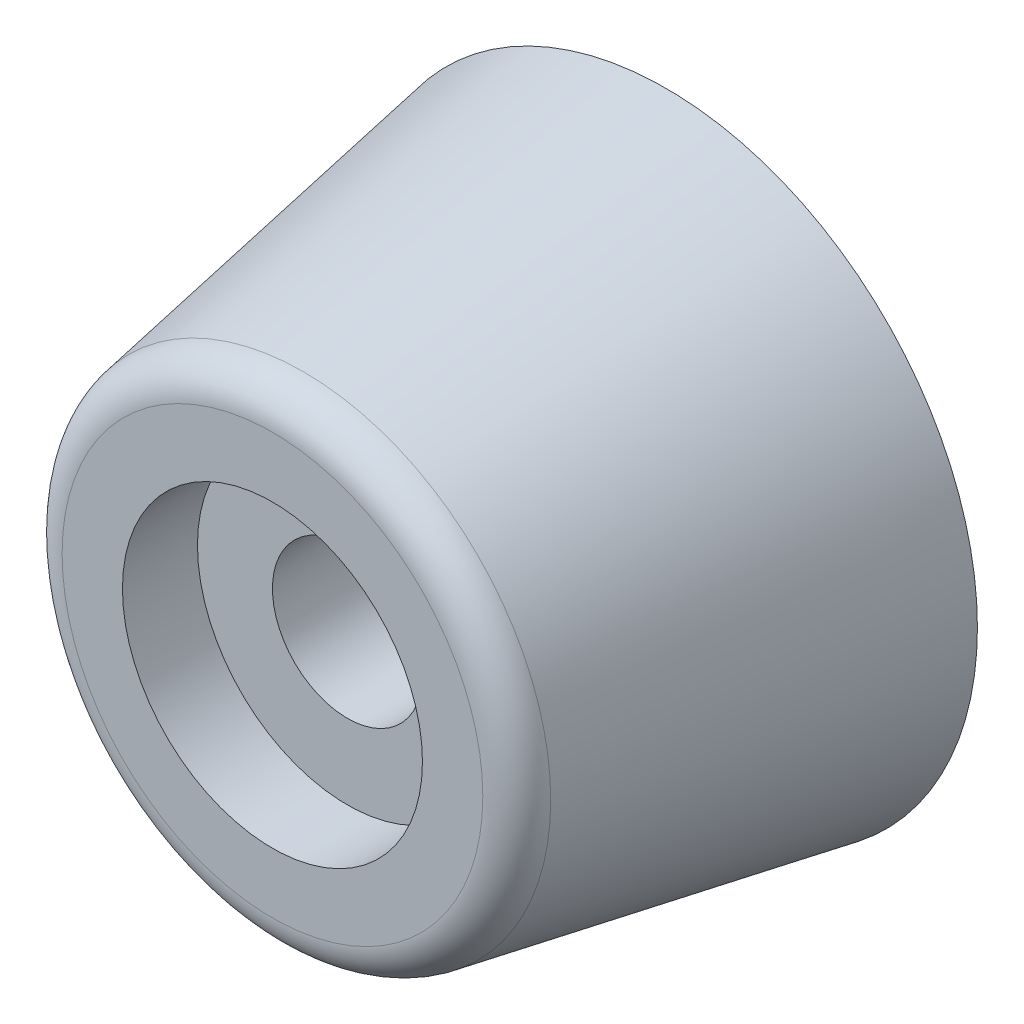
ISO-10303-21;
HEADER;
FILE_DESCRIPTION(('STEP AP214'),'2;1');
FILE_NAME('part.step','',(''),(''),'','','');
FILE_SCHEMA(('AUTOMOTIVE_DESIGN { 1 0 10303 214 1 1 1 1 }'));
ENDSEC;
DATA;
#1=APPLICATION_CONTEXT('core data for automotive mechanical design processes');
#2=APPLICATION_PROTOCOL_DEFINITION('international standard','automotive_design',2000,#1);
#3=PRODUCT_CONTEXT('',#1,'mechanical');
#4=PRODUCT('Part','Part','',(#3));
#5=PRODUCT_RELATED_PRODUCT_CATEGORY('part','',(#4));
#6=PRODUCT_DEFINITION_FORMATION('','',#4);
#7=PRODUCT_DEFINITION_CONTEXT('part definition',#1,'design');
#8=PRODUCT_DEFINITION('design','',#6,#7);
#9=PRODUCT_DEFINITION_SHAPE('','',#8);
#10=(LENGTH_UNIT() NAMED_UNIT(*) SI_UNIT(.MILLI.,.METRE.));
#11=(NAMED_UNIT(*) PLANE_ANGLE_UNIT() SI_UNIT($,.RADIAN.));
#12=(NAMED_UNIT(*) SI_UNIT($,.STERADIAN.) SOLID_ANGLE_UNIT());
#13=UNCERTAINTY_MEASURE_WITH_UNIT(LENGTH_MEASURE(1.E-05),#10,'distance_accuracy_value','');
#14=(GEOMETRIC_REPRESENTATION_CONTEXT(3) GLOBAL_UNCERTAINTY_ASSIGNED_CONTEXT((#13)) GLOBAL_UNIT_ASSIGNED_CONTEXT((#10,
#11,#12)) REPRESENTATION_CONTEXT('',''));
#15=CARTESIAN_POINT('',(0.,0.,0.));
#16=DIRECTION('',(0.,0.,1.));
#17=DIRECTION('',(1.,0.,0.));
#18=AXIS2_PLACEMENT_3D('',#15,#16,#17);
#19=CARTESIAN_POINT('',(0.,0.,0.));
#20=DIRECTION('',(0.,0.,-1.));
#21=DIRECTION('',(1.,0.,0.));
#22=AXIS2_PLACEMENT_3D('',#19,#20,#21);
#23=CONICAL_SURFACE('',#22,8.3,0.174532925199433);
#24=CARTESIAN_POINT('',(0.,0.,9.67364817766693));
#25=DIRECTION('',(0.,0.,-1.));
#26=DIRECTION('',(-1.,0.,0.));
#27=AXIS2_PLACEMENT_3D('',#24,#25,#26);
#28=CIRCLE('',#27,6.59427482439604);
#29=CARTESIAN_POINT('',(-6.59427482439604,0.,9.67364817766693));
#30=VERTEX_POINT('',#29);
#31=EDGE_CURVE('E10',#30,#30,#28,.T.);
#32=ORIENTED_EDGE('',*,*,#31,.T.);
#33=EDGE_LOOP('',(#32));
#34=FACE_BOUND('',#33,.T.);
#35=CARTESIAN_POINT('',(0.,0.,0.));
#36=DIRECTION('',(0.,0.,1.));
#37=DIRECTION('',(1.,0.,0.));
#38=AXIS2_PLACEMENT_3D('',#35,#36,#37);
#39=CIRCLE('',#38,8.3);
#40=CARTESIAN_POINT('',(8.3,0.,0.));
#41=VERTEX_POINT('',#40);
#42=EDGE_CURVE('E42',#41,#41,#39,.T.);
#43=ORIENTED_EDGE('',*,*,#42,.T.);
#44=EDGE_LOOP('',(#43));
#45=FACE_BOUND('',#44,.T.);
#46=ADVANCED_FACE('F31',(#34,#45),#23,.T.);
#47=CARTESIAN_POINT('',(0.,0.,10.5));
#48=DIRECTION('',(0.,0.,1.));
#49=DIRECTION('',(1.,0.,0.));
#50=AXIS2_PLACEMENT_3D('',#47,#48,#49);
#51=PLANE('',#50);
#52=CARTESIAN_POINT('',(0.,0.,10.5));
#53=DIRECTION('',(0.,0.,1.));
#54=DIRECTION('',(1.,0.,0.));
#55=AXIS2_PLACEMENT_3D('',#52,#53,#54);
#56=CIRCLE('',#55,5.60946707138383);
#57=CARTESIAN_POINT('',(5.60946707138383,0.,10.5));
#58=VERTEX_POINT('',#57);
#59=EDGE_CURVE('E38',#58,#58,#56,.T.);
#60=ORIENTED_EDGE('',*,*,#59,.T.);
#61=EDGE_LOOP('',(#60));
#62=FACE_BOUND('',#61,.T.);
#63=CARTESIAN_POINT('',(0.,0.,10.5));
#64=DIRECTION('',(0.,0.,1.));
#65=DIRECTION('',(1.,0.,0.));
#66=AXIS2_PLACEMENT_3D('',#63,#64,#65);
#67=CIRCLE('',#66,4.);
#68=CARTESIAN_POINT('',(4.,0.,10.5));
#69=VERTEX_POINT('',#68);
#70=EDGE_CURVE('E49',#69,#69,#67,.T.);
#71=ORIENTED_EDGE('',*,*,#70,.F.);
#72=EDGE_LOOP('',(#71));
#73=FACE_BOUND('',#72,.T.);
#74=ADVANCED_FACE('F77',(#62,#73),#51,.T.);
#75=CARTESIAN_POINT('',(0.,0.,0.));
#76=DIRECTION('',(0.,0.,1.));
#77=DIRECTION('',(1.,0.,0.));
#78=AXIS2_PLACEMENT_3D('',#75,#76,#77);
#79=PLANE('',#78);
#80=CARTESIAN_POINT('',(0.,0.,0.));
#81=DIRECTION('',(0.,0.,1.));
#82=DIRECTION('',(1.,0.,0.));
#83=AXIS2_PLACEMENT_3D('',#80,#81,#82);
#84=CIRCLE('',#83,2.);
#85=CARTESIAN_POINT('',(2.,0.,0.));
#86=VERTEX_POINT('',#85);
#87=EDGE_CURVE('E52',#86,#86,#84,.T.);
#88=ORIENTED_EDGE('',*,*,#87,.T.);
#89=EDGE_LOOP('',(#88));
#90=FACE_BOUND('',#89,.T.);
#91=ORIENTED_EDGE('',*,*,#42,.F.);
#92=EDGE_LOOP('',(#91));
#93=FACE_BOUND('',#92,.T.);
#94=ADVANCED_FACE('F73',(#90,#93),#79,.F.);
#95=CARTESIAN_POINT('',(0.,0.,8.5));
#96=DIRECTION('',(0.,0.,1.));
#97=DIRECTION('',(1.,0.,0.));
#98=AXIS2_PLACEMENT_3D('',#95,#96,#97);
#99=CYLINDRICAL_SURFACE('',#98,4.);
#100=CARTESIAN_POINT('',(0.,0.,8.5));
#101=DIRECTION('',(0.,0.,1.));
#102=DIRECTION('',(1.,0.,0.));
#103=AXIS2_PLACEMENT_3D('',#100,#101,#102);
#104=CIRCLE('',#103,4.);
#105=CARTESIAN_POINT('',(4.,0.,8.5));
#106=VERTEX_POINT('',#105);
#107=EDGE_CURVE('E46',#106,#106,#104,.T.);
#108=ORIENTED_EDGE('',*,*,#107,.F.);
#109=EDGE_LOOP('',(#108));
#110=FACE_BOUND('',#109,.T.);
#111=ORIENTED_EDGE('',*,*,#70,.T.);
#112=EDGE_LOOP('',(#111));
#113=FACE_BOUND('',#112,.T.);
#114=ADVANCED_FACE('F67',(#110,#113),#99,.F.);
#115=CARTESIAN_POINT('',(0.,0.,8.5));
#116=DIRECTION('',(0.,0.,1.));
#117=DIRECTION('',(1.,0.,0.));
#118=AXIS2_PLACEMENT_3D('',#115,#116,#117);
#119=PLANE('',#118);
#120=CARTESIAN_POINT('',(0.,0.,8.5));
#121=DIRECTION('',(0.,0.,1.));
#122=DIRECTION('',(1.,0.,0.));
#123=AXIS2_PLACEMENT_3D('',#120,#121,#122);
#124=CIRCLE('',#123,2.);
#125=CARTESIAN_POINT('',(2.,0.,8.5));
#126=VERTEX_POINT('',#125);
#127=EDGE_CURVE('E57',#126,#126,#124,.T.);
#128=ORIENTED_EDGE('',*,*,#127,.F.);
#129=EDGE_LOOP('',(#128));
#130=FACE_BOUND('',#129,.T.);
#131=ORIENTED_EDGE('',*,*,#107,.T.);
#132=EDGE_LOOP('',(#131));
#133=FACE_BOUND('',#132,.T.);
#134=ADVANCED_FACE('F64',(#130,#133),#119,.T.);
#135=CARTESIAN_POINT('',(0.,0.,-5.5));
#136=DIRECTION('',(0.,0.,1.));
#137=DIRECTION('',(1.,0.,0.));
#138=AXIS2_PLACEMENT_3D('',#135,#136,#137);
#139=CYLINDRICAL_SURFACE('',#138,2.);
#140=ORIENTED_EDGE('',*,*,#127,.T.);
#141=EDGE_LOOP('',(#140));
#142=FACE_BOUND('',#141,.T.);
#143=ORIENTED_EDGE('',*,*,#87,.F.);
#144=EDGE_LOOP('',(#143));
#145=FACE_BOUND('',#144,.T.);
#146=ADVANCED_FACE('F61',(#142,#145),#139,.F.);
#147=CARTESIAN_POINT('',(0.,0.,9.5));
#148=DIRECTION('',(0.,0.,1.));
#149=DIRECTION('',(1.,0.,0.));
#150=AXIS2_PLACEMENT_3D('',#147,#148,#149);
#151=TOROIDAL_SURFACE('',#150,5.60946707138383,1.);
#152=ORIENTED_EDGE('',*,*,#31,.F.);
#153=EDGE_LOOP('',(#152));
#154=FACE_BOUND('',#153,.T.);
#155=ORIENTED_EDGE('',*,*,#59,.F.);
#156=EDGE_LOOP('',(#155));
#157=FACE_BOUND('',#156,.T.);
#158=ADVANCED_FACE('F33',(#154,#157),#151,.T.);
#159=CLOSED_SHELL('',(#46,#74,#94,#114,#134,#146,#158));
#160=MANIFOLD_SOLID_BREP('B2',#159);
#161=ADVANCED_BREP_SHAPE_REPRESENTATION('',(#18,#160),#14);
#162=SHAPE_DEFINITION_REPRESENTATION(#9,#161);
ENDSEC;
END-ISO-10303-21;
